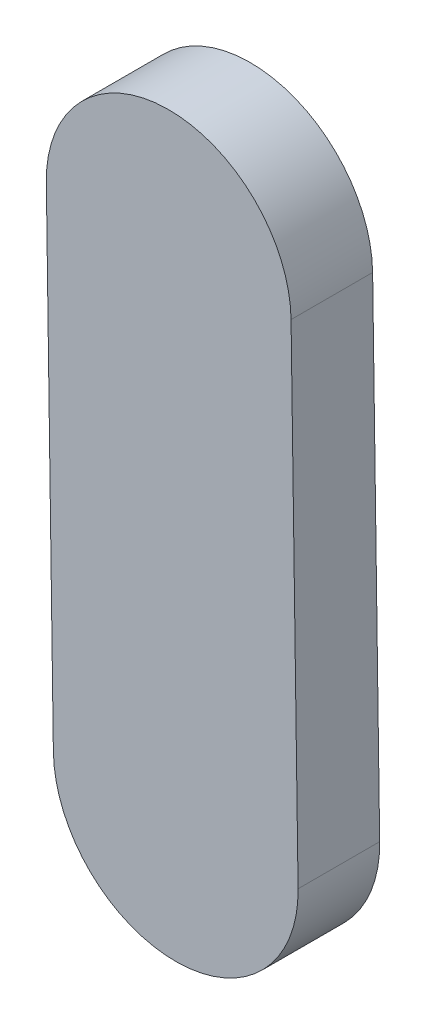
ISO-10303-21;
HEADER;
FILE_DESCRIPTION(('STEP AP214'),'2;1');
FILE_NAME('part.step','',(''),(''),'','','');
FILE_SCHEMA(('AUTOMOTIVE_DESIGN { 1 0 10303 214 1 1 1 1 }'));
ENDSEC;
DATA;
#1=APPLICATION_CONTEXT('core data for automotive mechanical design processes');
#2=APPLICATION_PROTOCOL_DEFINITION('international standard','automotive_design',2000,#1);
#3=PRODUCT_CONTEXT('',#1,'mechanical');
#4=PRODUCT('Part','Part','',(#3));
#5=PRODUCT_RELATED_PRODUCT_CATEGORY('part','',(#4));
#6=PRODUCT_DEFINITION_FORMATION('','',#4);
#7=PRODUCT_DEFINITION_CONTEXT('part definition',#1,'design');
#8=PRODUCT_DEFINITION('design','',#6,#7);
#9=PRODUCT_DEFINITION_SHAPE('','',#8);
#10=(LENGTH_UNIT() NAMED_UNIT(*) SI_UNIT(.MILLI.,.METRE.));
#11=(NAMED_UNIT(*) PLANE_ANGLE_UNIT() SI_UNIT($,.RADIAN.));
#12=(NAMED_UNIT(*) SI_UNIT($,.STERADIAN.) SOLID_ANGLE_UNIT());
#13=UNCERTAINTY_MEASURE_WITH_UNIT(LENGTH_MEASURE(1.E-05),#10,'distance_accuracy_value','');
#14=(GEOMETRIC_REPRESENTATION_CONTEXT(3) GLOBAL_UNCERTAINTY_ASSIGNED_CONTEXT((#13)) GLOBAL_UNIT_ASSIGNED_CONTEXT((#10,
#11,#12)) REPRESENTATION_CONTEXT('',''));
#15=CARTESIAN_POINT('',(0.,0.,0.));
#16=DIRECTION('',(0.,0.,1.));
#17=DIRECTION('',(1.,0.,0.));
#18=AXIS2_PLACEMENT_3D('',#15,#16,#17);
#19=CARTESIAN_POINT('',(-3.87722109118069,6.21692402097923,1.));
#20=DIRECTION('',(0.,0.,-1.));
#21=DIRECTION('',(-1.,0.,0.));
#22=AXIS2_PLACEMENT_3D('',#19,#20,#21);
#23=CYLINDRICAL_SURFACE('',#22,1.50015452147031);
#24=CARTESIAN_POINT('',(-3.87722109118069,6.21692402097923,0.));
#25=DIRECTION('',(0.,0.,1.));
#26=DIRECTION('',(1.,0.,0.));
#27=AXIS2_PLACEMENT_3D('',#24,#25,#26);
#28=CIRCLE('',#27,1.50015452147031);
#29=CARTESIAN_POINT('',(-2.37722109118069,6.2384551214577,0.));
#30=VERTEX_POINT('',#29);
#31=CARTESIAN_POINT('',(-5.37722109118069,6.19539292050077,0.));
#32=VERTEX_POINT('',#31);
#33=EDGE_CURVE('E101',#30,#32,#28,.T.);
#34=ORIENTED_EDGE('',*,*,#33,.T.);
#35=DIRECTION('',(0.,0.,-1.));
#36=VECTOR('',#35,1.);
#37=CARTESIAN_POINT('',(-5.37722109118069,6.19539292050077,1.));
#38=LINE('',#37,#36);
#39=CARTESIAN_POINT('',(-5.37722109118069,6.19539292050077,1.));
#40=VERTEX_POINT('',#39);
#41=EDGE_CURVE('E11',#40,#32,#38,.T.);
#42=ORIENTED_EDGE('',*,*,#41,.F.);
#43=CARTESIAN_POINT('',(-3.87722109118069,6.21692402097923,1.));
#44=DIRECTION('',(0.,0.,1.));
#45=DIRECTION('',(1.,0.,0.));
#46=AXIS2_PLACEMENT_3D('',#43,#44,#45);
#47=CIRCLE('',#46,1.50015452147031);
#48=CARTESIAN_POINT('',(-2.37722109118069,6.2384551214577,1.));
#49=VERTEX_POINT('',#48);
#50=EDGE_CURVE('E89',#49,#40,#47,.T.);
#51=ORIENTED_EDGE('',*,*,#50,.F.);
#52=DIRECTION('',(0.,0.,-1.));
#53=VECTOR('',#52,1.);
#54=CARTESIAN_POINT('',(-2.37722109118069,6.2384551214577,1.));
#55=LINE('',#54,#53);
#56=EDGE_CURVE('E97',#49,#30,#55,.T.);
#57=ORIENTED_EDGE('',*,*,#56,.T.);
#58=EDGE_LOOP('',(#34,#42,#51,#57));
#59=FACE_BOUND('',#58,.T.);
#60=ADVANCED_FACE('F38',(#59),#23,.T.);
#61=CARTESIAN_POINT('',(-5.37722109118069,6.19539292050077,1.));
#62=DIRECTION('',(0.999896996297316,0.0143525884635975,0.));
#63=DIRECTION('',(-0.0143525884635975,0.999896996297316,0.));
#64=AXIS2_PLACEMENT_3D('',#61,#62,#63);
#65=PLANE('',#64);
#66=DIRECTION('',(0.0143525884635975,-0.999896996297316,0.));
#67=VECTOR('',#66,1.);
#68=CARTESIAN_POINT('',(-5.37722109118069,6.19539292050077,0.));
#69=LINE('',#68,#67);
#70=CARTESIAN_POINT('',(-5.29109668926681,0.195392920500767,0.));
#71=VERTEX_POINT('',#70);
#72=EDGE_CURVE('E93',#32,#71,#69,.T.);
#73=ORIENTED_EDGE('',*,*,#72,.T.);
#74=DIRECTION('',(0.,0.,-1.));
#75=VECTOR('',#74,1.);
#76=CARTESIAN_POINT('',(-5.29109668926681,0.195392920500767,1.));
#77=LINE('',#76,#75);
#78=CARTESIAN_POINT('',(-5.29109668926681,0.195392920500767,1.));
#79=VERTEX_POINT('',#78);
#80=EDGE_CURVE('E46',#79,#71,#77,.T.);
#81=ORIENTED_EDGE('',*,*,#80,.F.);
#82=DIRECTION('',(0.0143525884635975,-0.999896996297316,0.));
#83=VECTOR('',#82,1.);
#84=CARTESIAN_POINT('',(-5.37722109118069,6.19539292050077,1.));
#85=LINE('',#84,#83);
#86=EDGE_CURVE('E84',#40,#79,#85,.T.);
#87=ORIENTED_EDGE('',*,*,#86,.F.);
#88=ORIENTED_EDGE('',*,*,#41,.T.);
#89=EDGE_LOOP('',(#73,#81,#87,#88));
#90=FACE_BOUND('',#89,.T.);
#91=ADVANCED_FACE('F92',(#90),#65,.F.);
#92=CARTESIAN_POINT('',(-3.79109668926681,0.216924020979235,1.));
#93=DIRECTION('',(0.,0.,-1.));
#94=DIRECTION('',(-1.,0.,0.));
#95=AXIS2_PLACEMENT_3D('',#92,#93,#94);
#96=CYLINDRICAL_SURFACE('',#95,1.50015452147031);
#97=CARTESIAN_POINT('',(-3.79109668926681,0.216924020979235,0.));
#98=DIRECTION('',(0.,0.,1.));
#99=DIRECTION('',(1.,0.,0.));
#100=AXIS2_PLACEMENT_3D('',#97,#98,#99);
#101=CIRCLE('',#100,1.50015452147031);
#102=CARTESIAN_POINT('',(-2.29109668926681,0.238455121457704,0.));
#103=VERTEX_POINT('',#102);
#104=EDGE_CURVE('E71',#71,#103,#101,.T.);
#105=ORIENTED_EDGE('',*,*,#104,.T.);
#106=DIRECTION('',(0.,0.,-1.));
#107=VECTOR('',#106,1.);
#108=CARTESIAN_POINT('',(-2.29109668926681,0.238455121457704,1.));
#109=LINE('',#108,#107);
#110=CARTESIAN_POINT('',(-2.29109668926681,0.238455121457704,1.));
#111=VERTEX_POINT('',#110);
#112=EDGE_CURVE('E94',#111,#103,#109,.T.);
#113=ORIENTED_EDGE('',*,*,#112,.F.);
#114=CARTESIAN_POINT('',(-3.79109668926681,0.216924020979235,1.));
#115=DIRECTION('',(0.,0.,1.));
#116=DIRECTION('',(1.,0.,0.));
#117=AXIS2_PLACEMENT_3D('',#114,#115,#116);
#118=CIRCLE('',#117,1.50015452147031);
#119=EDGE_CURVE('E87',#79,#111,#118,.T.);
#120=ORIENTED_EDGE('',*,*,#119,.F.);
#121=ORIENTED_EDGE('',*,*,#80,.T.);
#122=EDGE_LOOP('',(#105,#113,#120,#121));
#123=FACE_BOUND('',#122,.T.);
#124=ADVANCED_FACE('F95',(#123),#96,.T.);
#125=CARTESIAN_POINT('',(-2.37722109118069,6.2384551214577,1.));
#126=DIRECTION('',(-0.999896996297316,-0.0143525884635977,0.));
#127=DIRECTION('',(0.0143525884635977,-0.999896996297316,0.));
#128=AXIS2_PLACEMENT_3D('',#125,#126,#127);
#129=PLANE('',#128);
#130=DIRECTION('',(-0.0143525884635977,0.999896996297316,0.));
#131=VECTOR('',#130,1.);
#132=CARTESIAN_POINT('',(-2.37722109118069,6.2384551214577,0.));
#133=LINE('',#132,#131);
#134=EDGE_CURVE('E77',#103,#30,#133,.T.);
#135=ORIENTED_EDGE('',*,*,#134,.T.);
#136=ORIENTED_EDGE('',*,*,#56,.F.);
#137=DIRECTION('',(-0.0143525884635977,0.999896996297316,0.));
#138=VECTOR('',#137,1.);
#139=CARTESIAN_POINT('',(-2.37722109118069,6.2384551214577,1.));
#140=LINE('',#139,#138);
#141=EDGE_CURVE('E54',#111,#49,#140,.T.);
#142=ORIENTED_EDGE('',*,*,#141,.F.);
#143=ORIENTED_EDGE('',*,*,#112,.T.);
#144=EDGE_LOOP('',(#135,#136,#142,#143));
#145=FACE_BOUND('',#144,.T.);
#146=ADVANCED_FACE('F108',(#145),#129,.F.);
#147=CARTESIAN_POINT('',(-3.87722109118069,6.21692402097923,1.));
#148=DIRECTION('',(0.,0.,1.));
#149=DIRECTION('',(1.,0.,0.));
#150=AXIS2_PLACEMENT_3D('',#147,#148,#149);
#151=PLANE('',#150);
#152=ORIENTED_EDGE('',*,*,#50,.T.);
#153=ORIENTED_EDGE('',*,*,#86,.T.);
#154=ORIENTED_EDGE('',*,*,#119,.T.);
#155=ORIENTED_EDGE('',*,*,#141,.T.);
#156=EDGE_LOOP('',(#152,#153,#154,#155));
#157=FACE_BOUND('',#156,.T.);
#158=ADVANCED_FACE('F85',(#157),#151,.T.);
#159=CARTESIAN_POINT('',(-3.87722109118069,6.21692402097923,0.));
#160=DIRECTION('',(0.,0.,1.));
#161=DIRECTION('',(1.,0.,0.));
#162=AXIS2_PLACEMENT_3D('',#159,#160,#161);
#163=PLANE('',#162);
#164=ORIENTED_EDGE('',*,*,#33,.F.);
#165=ORIENTED_EDGE('',*,*,#134,.F.);
#166=ORIENTED_EDGE('',*,*,#104,.F.);
#167=ORIENTED_EDGE('',*,*,#72,.F.);
#168=EDGE_LOOP('',(#164,#165,#166,#167));
#169=FACE_BOUND('',#168,.T.);
#170=ADVANCED_FACE('F111',(#169),#163,.F.);
#171=CLOSED_SHELL('',(#60,#91,#124,#146,#158,#170));
#172=MANIFOLD_SOLID_BREP('B2',#171);
#173=ADVANCED_BREP_SHAPE_REPRESENTATION('',(#18,#172),#14);
#174=SHAPE_DEFINITION_REPRESENTATION(#9,#173);
ENDSEC;
END-ISO-10303-21;
